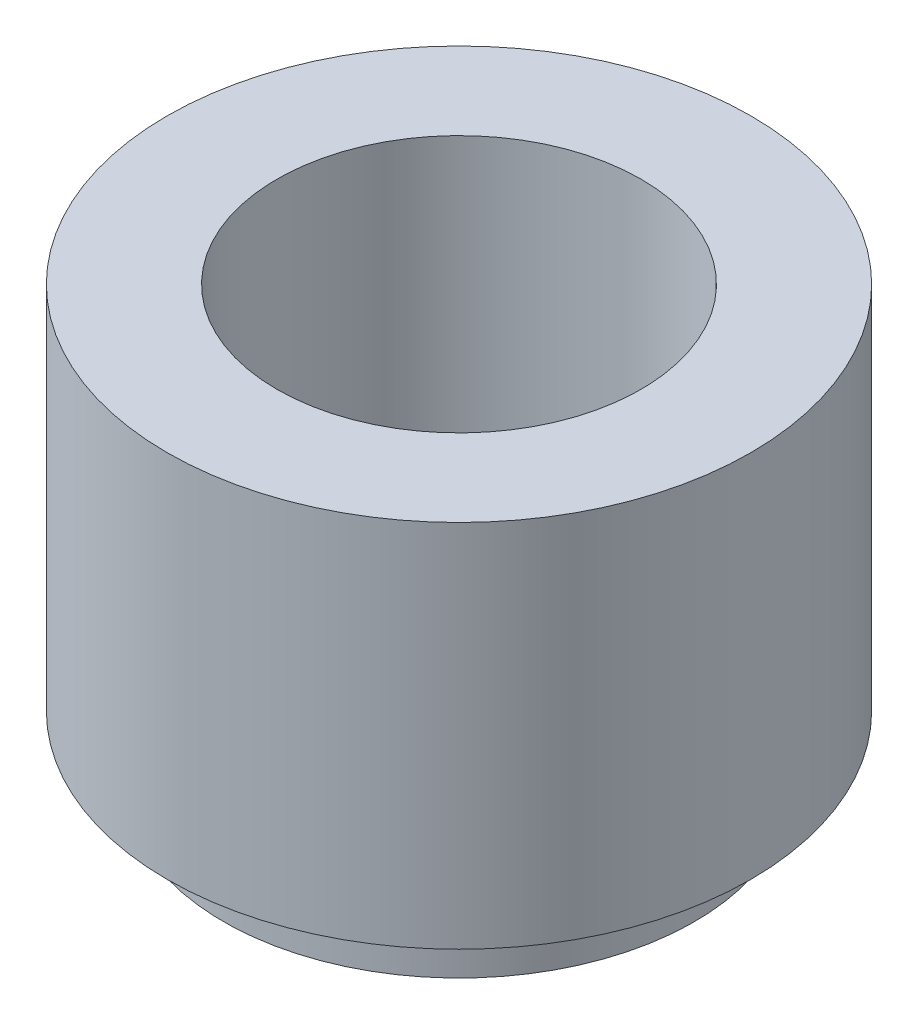
ISO-10303-21;
HEADER;
FILE_DESCRIPTION(('STEP AP214'),'2;1');
FILE_NAME('part.step','',(''),(''),'','','');
FILE_SCHEMA(('AUTOMOTIVE_DESIGN { 1 0 10303 214 1 1 1 1 }'));
ENDSEC;
DATA;
#1=APPLICATION_CONTEXT('core data for automotive mechanical design processes');
#2=APPLICATION_PROTOCOL_DEFINITION('international standard','automotive_design',2000,#1);
#3=PRODUCT_CONTEXT('',#1,'mechanical');
#4=PRODUCT('Part','Part','',(#3));
#5=PRODUCT_RELATED_PRODUCT_CATEGORY('part','',(#4));
#6=PRODUCT_DEFINITION_FORMATION('','',#4);
#7=PRODUCT_DEFINITION_CONTEXT('part definition',#1,'design');
#8=PRODUCT_DEFINITION('design','',#6,#7);
#9=PRODUCT_DEFINITION_SHAPE('','',#8);
#10=(LENGTH_UNIT() NAMED_UNIT(*) SI_UNIT(.MILLI.,.METRE.));
#11=(NAMED_UNIT(*) PLANE_ANGLE_UNIT() SI_UNIT($,.RADIAN.));
#12=(NAMED_UNIT(*) SI_UNIT($,.STERADIAN.) SOLID_ANGLE_UNIT());
#13=UNCERTAINTY_MEASURE_WITH_UNIT(LENGTH_MEASURE(1.E-05),#10,'distance_accuracy_value','');
#14=(GEOMETRIC_REPRESENTATION_CONTEXT(3) GLOBAL_UNCERTAINTY_ASSIGNED_CONTEXT((#13)) GLOBAL_UNIT_ASSIGNED_CONTEXT((#10,
#11,#12)) REPRESENTATION_CONTEXT('',''));
#15=CARTESIAN_POINT('',(0.,0.,0.));
#16=DIRECTION('',(0.,0.,1.));
#17=DIRECTION('',(1.,0.,0.));
#18=AXIS2_PLACEMENT_3D('',#15,#16,#17);
#19=CARTESIAN_POINT('',(0.,-6.35,0.));
#20=DIRECTION('',(0.,-1.,0.));
#21=DIRECTION('',(0.,0.,-1.));
#22=AXIS2_PLACEMENT_3D('',#19,#20,#21);
#23=PLANE('',#22);
#24=CARTESIAN_POINT('',(0.,-6.35,0.));
#25=DIRECTION('',(0.,-1.,0.));
#26=DIRECTION('',(0.,0.,-1.));
#27=AXIS2_PLACEMENT_3D('',#24,#25,#26);
#28=CIRCLE('',#27,7.9375);
#29=CARTESIAN_POINT('',(0.,-6.35,-7.9375));
#30=VERTEX_POINT('',#29);
#31=EDGE_CURVE('E50',#30,#30,#28,.T.);
#32=ORIENTED_EDGE('',*,*,#31,.F.);
#33=EDGE_LOOP('',(#32));
#34=FACE_BOUND('',#33,.T.);
#35=CARTESIAN_POINT('',(0.,-6.35,0.));
#36=DIRECTION('',(0.,-1.,0.));
#37=DIRECTION('',(0.,0.,-1.));
#38=AXIS2_PLACEMENT_3D('',#35,#36,#37);
#39=CIRCLE('',#38,9.525);
#40=CARTESIAN_POINT('',(0.,-6.35,-9.525));
#41=VERTEX_POINT('',#40);
#42=EDGE_CURVE('E79',#41,#41,#39,.T.);
#43=ORIENTED_EDGE('',*,*,#42,.T.);
#44=EDGE_LOOP('',(#43));
#45=FACE_BOUND('',#44,.T.);
#46=ADVANCED_FACE('F41',(#34,#45),#23,.T.);
#47=CARTESIAN_POINT('',(0.,5.715,0.));
#48=DIRECTION('',(0.,-1.,0.));
#49=DIRECTION('',(0.,0.,-1.));
#50=AXIS2_PLACEMENT_3D('',#47,#48,#49);
#51=CYLINDRICAL_SURFACE('',#50,9.525);
#52=CARTESIAN_POINT('',(0.,5.715,0.));
#53=DIRECTION('',(0.,1.,0.));
#54=DIRECTION('',(0.,0.,1.));
#55=AXIS2_PLACEMENT_3D('',#52,#53,#54);
#56=CIRCLE('',#55,9.525);
#57=CARTESIAN_POINT('',(0.,5.715,9.525));
#58=VERTEX_POINT('',#57);
#59=EDGE_CURVE('E45',#58,#58,#56,.T.);
#60=ORIENTED_EDGE('',*,*,#59,.F.);
#61=EDGE_LOOP('',(#60));
#62=FACE_BOUND('',#61,.T.);
#63=ORIENTED_EDGE('',*,*,#42,.F.);
#64=EDGE_LOOP('',(#63));
#65=FACE_BOUND('',#64,.T.);
#66=ADVANCED_FACE('F43',(#62,#65),#51,.T.);
#67=CARTESIAN_POINT('',(0.,5.715,0.));
#68=DIRECTION('',(0.,1.,0.));
#69=DIRECTION('',(0.,0.,1.));
#70=AXIS2_PLACEMENT_3D('',#67,#68,#69);
#71=PLANE('',#70);
#72=CARTESIAN_POINT('',(0.,5.715,0.));
#73=DIRECTION('',(0.,1.,0.));
#74=DIRECTION('',(0.,0.,1.));
#75=AXIS2_PLACEMENT_3D('',#72,#73,#74);
#76=CIRCLE('',#75,5.94359999999999);
#77=CARTESIAN_POINT('',(0.,5.715,5.94359999999999));
#78=VERTEX_POINT('',#77);
#79=EDGE_CURVE('E74',#78,#78,#76,.T.);
#80=ORIENTED_EDGE('',*,*,#79,.F.);
#81=EDGE_LOOP('',(#80));
#82=FACE_BOUND('',#81,.T.);
#83=ORIENTED_EDGE('',*,*,#59,.T.);
#84=EDGE_LOOP('',(#83));
#85=FACE_BOUND('',#84,.T.);
#86=ADVANCED_FACE('F88',(#82,#85),#71,.T.);
#87=CARTESIAN_POINT('',(0.,-7.40833333333333,0.));
#88=DIRECTION('',(0.,1.,0.));
#89=DIRECTION('',(0.,0.,1.));
#90=AXIS2_PLACEMENT_3D('',#87,#88,#89);
#91=CYLINDRICAL_SURFACE('',#90,7.9375);
#92=CARTESIAN_POINT('',(0.,-7.40833333333333,0.));
#93=DIRECTION('',(0.,-1.,0.));
#94=DIRECTION('',(0.,0.,-1.));
#95=AXIS2_PLACEMENT_3D('',#92,#93,#94);
#96=CIRCLE('',#95,7.9375);
#97=CARTESIAN_POINT('',(0.,-7.40833333333333,-7.9375));
#98=VERTEX_POINT('',#97);
#99=EDGE_CURVE('E60',#98,#98,#96,.T.);
#100=ORIENTED_EDGE('',*,*,#99,.F.);
#101=EDGE_LOOP('',(#100));
#102=FACE_BOUND('',#101,.T.);
#103=ORIENTED_EDGE('',*,*,#31,.T.);
#104=EDGE_LOOP('',(#103));
#105=FACE_BOUND('',#104,.T.);
#106=ADVANCED_FACE('F94',(#102,#105),#91,.T.);
#107=CARTESIAN_POINT('',(0.,-7.40833333333333,0.));
#108=DIRECTION('',(0.,-1.,0.));
#109=DIRECTION('',(0.,0.,-1.));
#110=AXIS2_PLACEMENT_3D('',#107,#108,#109);
#111=PLANE('',#110);
#112=CARTESIAN_POINT('',(0.,-7.40833333333333,0.));
#113=DIRECTION('',(0.,-1.,0.));
#114=DIRECTION('',(0.,0.,-1.));
#115=AXIS2_PLACEMENT_3D('',#112,#113,#114);
#116=CIRCLE('',#115,7.6835);
#117=CARTESIAN_POINT('',(0.,-7.40833333333333,-7.6835));
#118=VERTEX_POINT('',#117);
#119=EDGE_CURVE('E10',#118,#118,#116,.T.);
#120=ORIENTED_EDGE('',*,*,#119,.F.);
#121=EDGE_LOOP('',(#120));
#122=FACE_BOUND('',#121,.T.);
#123=ORIENTED_EDGE('',*,*,#99,.T.);
#124=EDGE_LOOP('',(#123));
#125=FACE_BOUND('',#124,.T.);
#126=ADVANCED_FACE('F106',(#122,#125),#111,.T.);
#127=CARTESIAN_POINT('',(0.,-8.46666666666667,0.));
#128=DIRECTION('',(0.,1.,0.));
#129=DIRECTION('',(0.,0.,1.));
#130=AXIS2_PLACEMENT_3D('',#127,#128,#129);
#131=CYLINDRICAL_SURFACE('',#130,7.6835);
#132=CARTESIAN_POINT('',(0.,-8.46666666666667,0.));
#133=DIRECTION('',(0.,-1.,0.));
#134=DIRECTION('',(0.,0.,-1.));
#135=AXIS2_PLACEMENT_3D('',#132,#133,#134);
#136=CIRCLE('',#135,7.6835);
#137=CARTESIAN_POINT('',(0.,-8.46666666666667,-7.6835));
#138=VERTEX_POINT('',#137);
#139=EDGE_CURVE('E58',#138,#138,#136,.T.);
#140=ORIENTED_EDGE('',*,*,#139,.F.);
#141=EDGE_LOOP('',(#140));
#142=FACE_BOUND('',#141,.T.);
#143=ORIENTED_EDGE('',*,*,#119,.T.);
#144=EDGE_LOOP('',(#143));
#145=FACE_BOUND('',#144,.T.);
#146=ADVANCED_FACE('F110',(#142,#145),#131,.T.);
#147=CARTESIAN_POINT('',(0.,-8.46666666666667,0.));
#148=DIRECTION('',(0.,-1.,0.));
#149=DIRECTION('',(0.,0.,-1.));
#150=AXIS2_PLACEMENT_3D('',#147,#148,#149);
#151=PLANE('',#150);
#152=CARTESIAN_POINT('',(0.,-8.46666666666667,0.));
#153=DIRECTION('',(0.,1.,0.));
#154=DIRECTION('',(0.,0.,1.));
#155=AXIS2_PLACEMENT_3D('',#152,#153,#154);
#156=CIRCLE('',#155,5.9436);
#157=CARTESIAN_POINT('',(0.,-8.46666666666667,5.9436));
#158=VERTEX_POINT('',#157);
#159=EDGE_CURVE('E69',#158,#158,#156,.T.);
#160=ORIENTED_EDGE('',*,*,#159,.T.);
#161=EDGE_LOOP('',(#160));
#162=FACE_BOUND('',#161,.T.);
#163=ORIENTED_EDGE('',*,*,#139,.T.);
#164=EDGE_LOOP('',(#163));
#165=FACE_BOUND('',#164,.T.);
#166=ADVANCED_FACE('F114',(#162,#165),#151,.T.);
#167=CARTESIAN_POINT('',(0.,5.715,0.));
#168=DIRECTION('',(0.,1.,0.));
#169=DIRECTION('',(0.,0.,1.));
#170=AXIS2_PLACEMENT_3D('',#167,#168,#169);
#171=CYLINDRICAL_SURFACE('',#170,5.94359999999999);
#172=ORIENTED_EDGE('',*,*,#159,.F.);
#173=EDGE_LOOP('',(#172));
#174=FACE_BOUND('',#173,.T.);
#175=ORIENTED_EDGE('',*,*,#79,.T.);
#176=EDGE_LOOP('',(#175));
#177=FACE_BOUND('',#176,.T.);
#178=ADVANCED_FACE('F118',(#174,#177),#171,.F.);
#179=CLOSED_SHELL('',(#46,#66,#86,#106,#126,#146,#166,#178));
#180=MANIFOLD_SOLID_BREP('B2',#179);
#181=ADVANCED_BREP_SHAPE_REPRESENTATION('',(#18,#180),#14);
#182=SHAPE_DEFINITION_REPRESENTATION(#9,#181);
ENDSEC;
END-ISO-10303-21;
